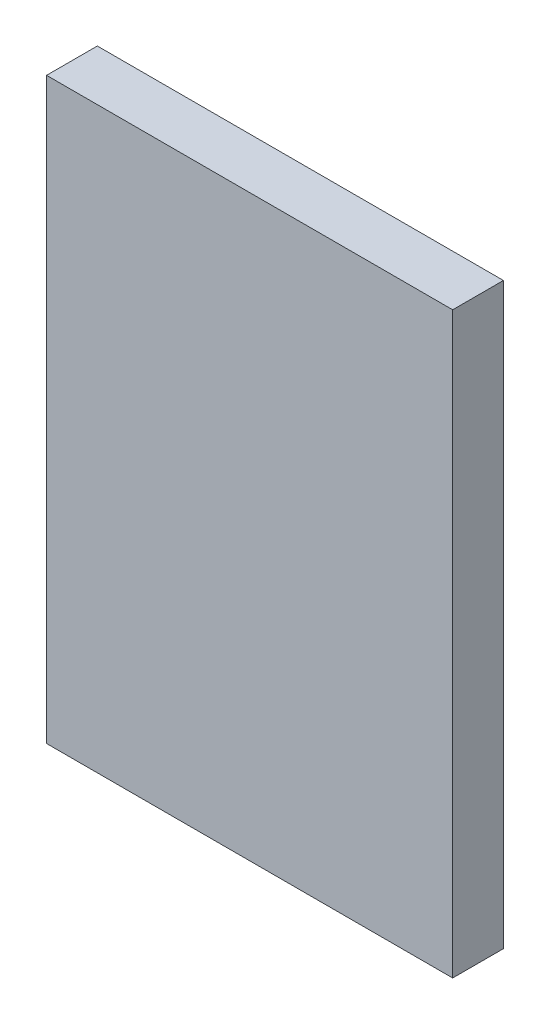
ISO-10303-21;
HEADER;
FILE_DESCRIPTION(('STEP AP214'),'2;1');
FILE_NAME('part.step','',(''),(''),'','','');
FILE_SCHEMA(('AUTOMOTIVE_DESIGN { 1 0 10303 214 1 1 1 1 }'));
ENDSEC;
DATA;
#1=APPLICATION_CONTEXT('core data for automotive mechanical design processes');
#2=APPLICATION_PROTOCOL_DEFINITION('international standard','automotive_design',2000,#1);
#3=PRODUCT_CONTEXT('',#1,'mechanical');
#4=PRODUCT('Part','Part','',(#3));
#5=PRODUCT_RELATED_PRODUCT_CATEGORY('part','',(#4));
#6=PRODUCT_DEFINITION_FORMATION('','',#4);
#7=PRODUCT_DEFINITION_CONTEXT('part definition',#1,'design');
#8=PRODUCT_DEFINITION('design','',#6,#7);
#9=PRODUCT_DEFINITION_SHAPE('','',#8);
#10=(LENGTH_UNIT() NAMED_UNIT(*) SI_UNIT(.MILLI.,.METRE.));
#11=(NAMED_UNIT(*) PLANE_ANGLE_UNIT() SI_UNIT($,.RADIAN.));
#12=(NAMED_UNIT(*) SI_UNIT($,.STERADIAN.) SOLID_ANGLE_UNIT());
#13=UNCERTAINTY_MEASURE_WITH_UNIT(LENGTH_MEASURE(1.E-05),#10,'distance_accuracy_value','');
#14=(GEOMETRIC_REPRESENTATION_CONTEXT(3) GLOBAL_UNCERTAINTY_ASSIGNED_CONTEXT((#13)) GLOBAL_UNIT_ASSIGNED_CONTEXT((#10,
#11,#12)) REPRESENTATION_CONTEXT('',''));
#15=CARTESIAN_POINT('',(0.,0.,0.));
#16=DIRECTION('',(0.,0.,1.));
#17=DIRECTION('',(1.,0.,0.));
#18=AXIS2_PLACEMENT_3D('',#15,#16,#17);
#19=CARTESIAN_POINT('',(20.,-28.5,-5.));
#20=DIRECTION('',(0.,-1.,0.));
#21=DIRECTION('',(1.,0.,0.));
#22=AXIS2_PLACEMENT_3D('',#19,#20,#21);
#23=PLANE('',#22);
#24=DIRECTION('',(1.,0.,0.));
#25=VECTOR('',#24,1.);
#26=CARTESIAN_POINT('',(20.,-28.5,0.));
#27=LINE('',#26,#25);
#28=CARTESIAN_POINT('',(-20.,-28.5,0.));
#29=VERTEX_POINT('',#28);
#30=CARTESIAN_POINT('',(20.,-28.5,0.));
#31=VERTEX_POINT('',#30);
#32=EDGE_CURVE('E98',#29,#31,#27,.T.);
#33=ORIENTED_EDGE('',*,*,#32,.F.);
#34=DIRECTION('',(0.,0.,1.));
#35=VECTOR('',#34,1.);
#36=CARTESIAN_POINT('',(-20.,-28.5,-5.));
#37=LINE('',#36,#35);
#38=CARTESIAN_POINT('',(-20.,-28.5,-5.));
#39=VERTEX_POINT('',#38);
#40=EDGE_CURVE('E11',#39,#29,#37,.T.);
#41=ORIENTED_EDGE('',*,*,#40,.F.);
#42=DIRECTION('',(1.,0.,0.));
#43=VECTOR('',#42,1.);
#44=CARTESIAN_POINT('',(20.,-28.5,-5.));
#45=LINE('',#44,#43);
#46=CARTESIAN_POINT('',(20.,-28.5,-5.));
#47=VERTEX_POINT('',#46);
#48=EDGE_CURVE('E92',#39,#47,#45,.T.);
#49=ORIENTED_EDGE('',*,*,#48,.T.);
#50=DIRECTION('',(0.,0.,1.));
#51=VECTOR('',#50,1.);
#52=CARTESIAN_POINT('',(20.,-28.5,-5.));
#53=LINE('',#52,#51);
#54=EDGE_CURVE('E37',#47,#31,#53,.T.);
#55=ORIENTED_EDGE('',*,*,#54,.T.);
#56=EDGE_LOOP('',(#33,#41,#49,#55));
#57=FACE_BOUND('',#56,.T.);
#58=ADVANCED_FACE('F34',(#57),#23,.T.);
#59=CARTESIAN_POINT('',(-20.,-28.5,-5.));
#60=DIRECTION('',(-1.,0.,0.));
#61=DIRECTION('',(0.,0.,1.));
#62=AXIS2_PLACEMENT_3D('',#59,#60,#61);
#63=PLANE('',#62);
#64=DIRECTION('',(0.,-1.,0.));
#65=VECTOR('',#64,1.);
#66=CARTESIAN_POINT('',(-20.,-28.5,0.));
#67=LINE('',#66,#65);
#68=CARTESIAN_POINT('',(-20.,28.5,0.));
#69=VERTEX_POINT('',#68);
#70=EDGE_CURVE('E94',#69,#29,#67,.T.);
#71=ORIENTED_EDGE('',*,*,#70,.F.);
#72=DIRECTION('',(0.,0.,1.));
#73=VECTOR('',#72,1.);
#74=CARTESIAN_POINT('',(-20.,28.5,-5.));
#75=LINE('',#74,#73);
#76=CARTESIAN_POINT('',(-20.,28.5,-5.));
#77=VERTEX_POINT('',#76);
#78=EDGE_CURVE('E43',#77,#69,#75,.T.);
#79=ORIENTED_EDGE('',*,*,#78,.F.);
#80=DIRECTION('',(0.,-1.,0.));
#81=VECTOR('',#80,1.);
#82=CARTESIAN_POINT('',(-20.,-28.5,-5.));
#83=LINE('',#82,#81);
#84=EDGE_CURVE('E89',#77,#39,#83,.T.);
#85=ORIENTED_EDGE('',*,*,#84,.T.);
#86=ORIENTED_EDGE('',*,*,#40,.T.);
#87=EDGE_LOOP('',(#71,#79,#85,#86));
#88=FACE_BOUND('',#87,.T.);
#89=ADVANCED_FACE('F108',(#88),#63,.T.);
#90=CARTESIAN_POINT('',(-20.,28.5,-5.));
#91=DIRECTION('',(0.,1.,0.));
#92=DIRECTION('',(0.,0.,1.));
#93=AXIS2_PLACEMENT_3D('',#90,#91,#92);
#94=PLANE('',#93);
#95=DIRECTION('',(-1.,0.,0.));
#96=VECTOR('',#95,1.);
#97=CARTESIAN_POINT('',(-20.,28.5,0.));
#98=LINE('',#97,#96);
#99=CARTESIAN_POINT('',(20.,28.5,0.));
#100=VERTEX_POINT('',#99);
#101=EDGE_CURVE('E84',#100,#69,#98,.T.);
#102=ORIENTED_EDGE('',*,*,#101,.F.);
#103=DIRECTION('',(0.,0.,1.));
#104=VECTOR('',#103,1.);
#105=CARTESIAN_POINT('',(20.,28.5,-5.));
#106=LINE('',#105,#104);
#107=CARTESIAN_POINT('',(20.,28.5,-5.));
#108=VERTEX_POINT('',#107);
#109=EDGE_CURVE('E79',#108,#100,#106,.T.);
#110=ORIENTED_EDGE('',*,*,#109,.F.);
#111=DIRECTION('',(-1.,0.,0.));
#112=VECTOR('',#111,1.);
#113=CARTESIAN_POINT('',(-20.,28.5,-5.));
#114=LINE('',#113,#112);
#115=EDGE_CURVE('E82',#108,#77,#114,.T.);
#116=ORIENTED_EDGE('',*,*,#115,.T.);
#117=ORIENTED_EDGE('',*,*,#78,.T.);
#118=EDGE_LOOP('',(#102,#110,#116,#117));
#119=FACE_BOUND('',#118,.T.);
#120=ADVANCED_FACE('F81',(#119),#94,.T.);
#121=CARTESIAN_POINT('',(20.,28.5,-5.));
#122=DIRECTION('',(1.,0.,0.));
#123=DIRECTION('',(0.,1.,0.));
#124=AXIS2_PLACEMENT_3D('',#121,#122,#123);
#125=PLANE('',#124);
#126=DIRECTION('',(0.,1.,0.));
#127=VECTOR('',#126,1.);
#128=CARTESIAN_POINT('',(20.,28.5,0.));
#129=LINE('',#128,#127);
#130=EDGE_CURVE('E101',#31,#100,#129,.T.);
#131=ORIENTED_EDGE('',*,*,#130,.F.);
#132=ORIENTED_EDGE('',*,*,#54,.F.);
#133=DIRECTION('',(0.,1.,0.));
#134=VECTOR('',#133,1.);
#135=CARTESIAN_POINT('',(20.,28.5,-5.));
#136=LINE('',#135,#134);
#137=EDGE_CURVE('E88',#47,#108,#136,.T.);
#138=ORIENTED_EDGE('',*,*,#137,.T.);
#139=ORIENTED_EDGE('',*,*,#109,.T.);
#140=EDGE_LOOP('',(#131,#132,#138,#139));
#141=FACE_BOUND('',#140,.T.);
#142=ADVANCED_FACE('F91',(#141),#125,.T.);
#143=CARTESIAN_POINT('',(0.,0.,-5.));
#144=DIRECTION('',(0.,0.,-1.));
#145=DIRECTION('',(-1.,0.,0.));
#146=AXIS2_PLACEMENT_3D('',#143,#144,#145);
#147=PLANE('',#146);
#148=ORIENTED_EDGE('',*,*,#48,.F.);
#149=ORIENTED_EDGE('',*,*,#84,.F.);
#150=ORIENTED_EDGE('',*,*,#115,.F.);
#151=ORIENTED_EDGE('',*,*,#137,.F.);
#152=EDGE_LOOP('',(#148,#149,#150,#151));
#153=FACE_BOUND('',#152,.T.);
#154=ADVANCED_FACE('F87',(#153),#147,.T.);
#155=CARTESIAN_POINT('',(0.,0.,0.));
#156=DIRECTION('',(0.,0.,-1.));
#157=DIRECTION('',(-1.,0.,0.));
#158=AXIS2_PLACEMENT_3D('',#155,#156,#157);
#159=PLANE('',#158);
#160=ORIENTED_EDGE('',*,*,#32,.T.);
#161=ORIENTED_EDGE('',*,*,#130,.T.);
#162=ORIENTED_EDGE('',*,*,#101,.T.);
#163=ORIENTED_EDGE('',*,*,#70,.T.);
#164=EDGE_LOOP('',(#160,#161,#162,#163));
#165=FACE_BOUND('',#164,.T.);
#166=ADVANCED_FACE('F107',(#165),#159,.F.);
#167=CLOSED_SHELL('',(#58,#89,#120,#142,#154,#166));
#168=MANIFOLD_SOLID_BREP('B2',#167);
#169=ADVANCED_BREP_SHAPE_REPRESENTATION('',(#18,#168),#14);
#170=SHAPE_DEFINITION_REPRESENTATION(#9,#169);
ENDSEC;
END-ISO-10303-21;
